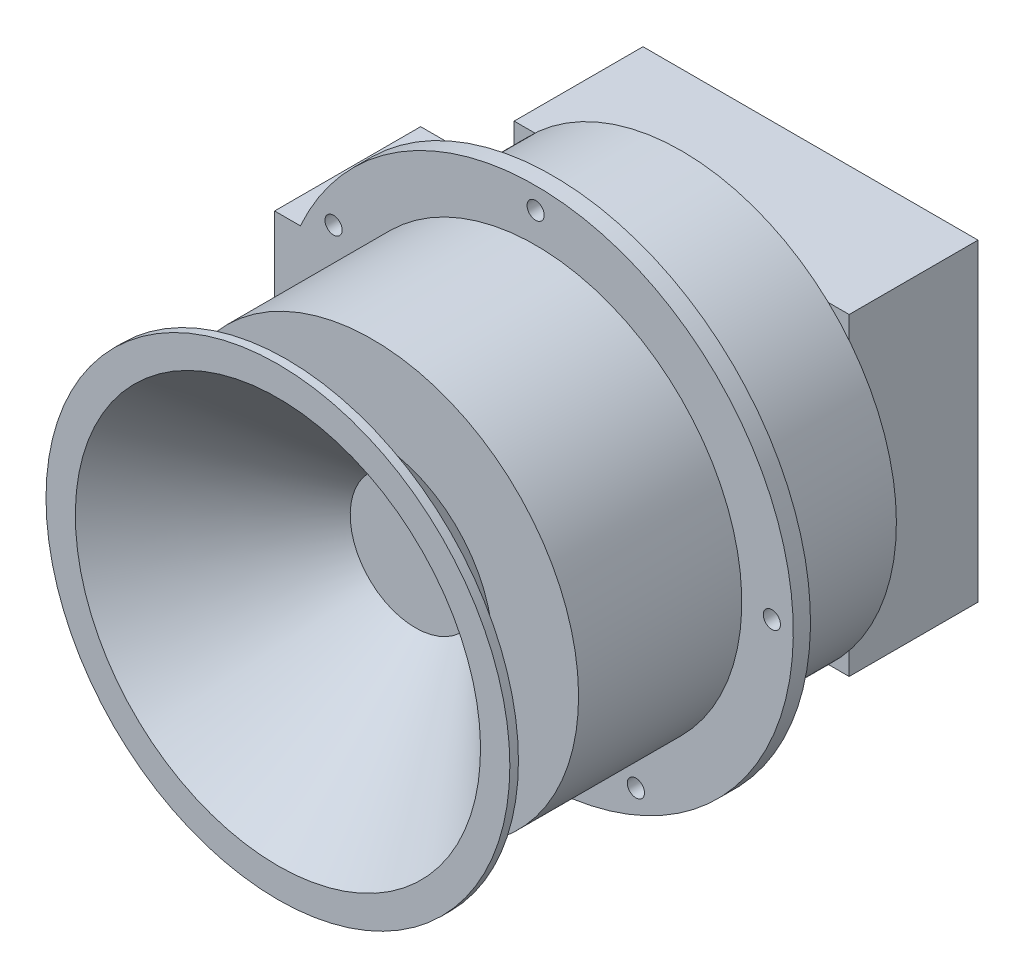
ISO-10303-21;
HEADER;
FILE_DESCRIPTION(('STEP AP214'),'2;1');
FILE_NAME('part.step','',(''),(''),'','','');
FILE_SCHEMA(('AUTOMOTIVE_DESIGN { 1 0 10303 214 1 1 1 1 }'));
ENDSEC;
DATA;
#1=APPLICATION_CONTEXT('core data for automotive mechanical design processes');
#2=APPLICATION_PROTOCOL_DEFINITION('international standard','automotive_design',2000,#1);
#3=PRODUCT_CONTEXT('',#1,'mechanical');
#4=PRODUCT('Part','Part','',(#3));
#5=PRODUCT_RELATED_PRODUCT_CATEGORY('part','',(#4));
#6=PRODUCT_DEFINITION_FORMATION('','',#4);
#7=PRODUCT_DEFINITION_CONTEXT('part definition',#1,'design');
#8=PRODUCT_DEFINITION('design','',#6,#7);
#9=PRODUCT_DEFINITION_SHAPE('','',#8);
#10=(LENGTH_UNIT() NAMED_UNIT(*) SI_UNIT(.MILLI.,.METRE.));
#11=(NAMED_UNIT(*) PLANE_ANGLE_UNIT() SI_UNIT($,.RADIAN.));
#12=(NAMED_UNIT(*) SI_UNIT($,.STERADIAN.) SOLID_ANGLE_UNIT());
#13=UNCERTAINTY_MEASURE_WITH_UNIT(LENGTH_MEASURE(1.E-05),#10,'distance_accuracy_value','');
#14=(GEOMETRIC_REPRESENTATION_CONTEXT(3) GLOBAL_UNCERTAINTY_ASSIGNED_CONTEXT((#13)) GLOBAL_UNIT_ASSIGNED_CONTEXT((#10,
#11,#12)) REPRESENTATION_CONTEXT('',''));
#15=CARTESIAN_POINT('',(0.,0.,0.));
#16=DIRECTION('',(0.,0.,1.));
#17=DIRECTION('',(1.,0.,0.));
#18=AXIS2_PLACEMENT_3D('',#15,#16,#17);
#19=CARTESIAN_POINT('',(-19.5,-18.25,-30.));
#20=DIRECTION('',(1.,0.,0.));
#21=DIRECTION('',(0.,0.,-1.));
#22=AXIS2_PLACEMENT_3D('',#19,#20,#21);
#23=PLANE('',#22);
#24=DIRECTION('',(0.,1.,0.));
#25=VECTOR('',#24,1.);
#26=CARTESIAN_POINT('',(-19.5,-18.25,-15.));
#27=LINE('',#26,#25);
#28=CARTESIAN_POINT('',(-19.5,-18.25,-15.));
#29=VERTEX_POINT('',#28);
#30=CARTESIAN_POINT('',(-19.5,18.25,-15.));
#31=VERTEX_POINT('',#30);
#32=EDGE_CURVE('E112',#29,#31,#27,.T.);
#33=ORIENTED_EDGE('',*,*,#32,.T.);
#34=DIRECTION('',(0.,0.,1.));
#35=VECTOR('',#34,1.);
#36=CARTESIAN_POINT('',(-19.5,18.25,-30.));
#37=LINE('',#36,#35);
#38=CARTESIAN_POINT('',(-19.5,18.25,-30.));
#39=VERTEX_POINT('',#38);
#40=EDGE_CURVE('E12',#39,#31,#37,.T.);
#41=ORIENTED_EDGE('',*,*,#40,.F.);
#42=DIRECTION('',(0.,1.,0.));
#43=VECTOR('',#42,1.);
#44=CARTESIAN_POINT('',(-19.5,-18.25,-30.));
#45=LINE('',#44,#43);
#46=CARTESIAN_POINT('',(-19.5,-18.25,-30.));
#47=VERTEX_POINT('',#46);
#48=EDGE_CURVE('E100',#47,#39,#45,.T.);
#49=ORIENTED_EDGE('',*,*,#48,.F.);
#50=DIRECTION('',(0.,0.,1.));
#51=VECTOR('',#50,1.);
#52=CARTESIAN_POINT('',(-19.5,-18.25,-30.));
#53=LINE('',#52,#51);
#54=EDGE_CURVE('E108',#47,#29,#53,.T.);
#55=ORIENTED_EDGE('',*,*,#54,.T.);
#56=EDGE_LOOP('',(#33,#41,#49,#55));
#57=FACE_BOUND('',#56,.T.);
#58=ADVANCED_FACE('F49',(#57),#23,.F.);
#59=CARTESIAN_POINT('',(19.5,18.25,-30.));
#60=DIRECTION('',(0.,-1.,0.));
#61=DIRECTION('',(0.,0.,-1.));
#62=AXIS2_PLACEMENT_3D('',#59,#60,#61);
#63=PLANE('',#62);
#64=DIRECTION('',(1.,0.,0.));
#65=VECTOR('',#64,1.);
#66=CARTESIAN_POINT('',(19.5,18.25,-15.));
#67=LINE('',#66,#65);
#68=CARTESIAN_POINT('',(19.5,18.25,-15.));
#69=VERTEX_POINT('',#68);
#70=EDGE_CURVE('E104',#31,#69,#67,.T.);
#71=ORIENTED_EDGE('',*,*,#70,.T.);
#72=DIRECTION('',(0.,0.,1.));
#73=VECTOR('',#72,1.);
#74=CARTESIAN_POINT('',(19.5,18.25,-30.));
#75=LINE('',#74,#73);
#76=CARTESIAN_POINT('',(19.5,18.25,-30.));
#77=VERTEX_POINT('',#76);
#78=EDGE_CURVE('E57',#77,#69,#75,.T.);
#79=ORIENTED_EDGE('',*,*,#78,.F.);
#80=DIRECTION('',(1.,0.,0.));
#81=VECTOR('',#80,1.);
#82=CARTESIAN_POINT('',(19.5,18.25,-30.));
#83=LINE('',#82,#81);
#84=EDGE_CURVE('E95',#39,#77,#83,.T.);
#85=ORIENTED_EDGE('',*,*,#84,.F.);
#86=ORIENTED_EDGE('',*,*,#40,.T.);
#87=EDGE_LOOP('',(#71,#79,#85,#86));
#88=FACE_BOUND('',#87,.T.);
#89=ADVANCED_FACE('F103',(#88),#63,.F.);
#90=CARTESIAN_POINT('',(19.5,-18.25,-30.));
#91=DIRECTION('',(-1.,0.,0.));
#92=DIRECTION('',(0.,0.,1.));
#93=AXIS2_PLACEMENT_3D('',#90,#91,#92);
#94=PLANE('',#93);
#95=DIRECTION('',(0.,-1.,0.));
#96=VECTOR('',#95,1.);
#97=CARTESIAN_POINT('',(19.5,-18.25,-15.));
#98=LINE('',#97,#96);
#99=CARTESIAN_POINT('',(19.5,-18.25,-15.));
#100=VERTEX_POINT('',#99);
#101=EDGE_CURVE('E82',#69,#100,#98,.T.);
#102=ORIENTED_EDGE('',*,*,#101,.T.);
#103=DIRECTION('',(0.,0.,1.));
#104=VECTOR('',#103,1.);
#105=CARTESIAN_POINT('',(19.5,-18.25,-30.));
#106=LINE('',#105,#104);
#107=CARTESIAN_POINT('',(19.5,-18.25,-30.));
#108=VERTEX_POINT('',#107);
#109=EDGE_CURVE('E105',#108,#100,#106,.T.);
#110=ORIENTED_EDGE('',*,*,#109,.F.);
#111=DIRECTION('',(0.,-1.,0.));
#112=VECTOR('',#111,1.);
#113=CARTESIAN_POINT('',(19.5,-18.25,-30.));
#114=LINE('',#113,#112);
#115=EDGE_CURVE('E98',#77,#108,#114,.T.);
#116=ORIENTED_EDGE('',*,*,#115,.F.);
#117=ORIENTED_EDGE('',*,*,#78,.T.);
#118=EDGE_LOOP('',(#102,#110,#116,#117));
#119=FACE_BOUND('',#118,.T.);
#120=ADVANCED_FACE('F106',(#119),#94,.F.);
#121=CARTESIAN_POINT('',(19.5,-18.25,-30.));
#122=DIRECTION('',(0.,1.,0.));
#123=DIRECTION('',(0.,0.,1.));
#124=AXIS2_PLACEMENT_3D('',#121,#122,#123);
#125=PLANE('',#124);
#126=DIRECTION('',(-1.,0.,0.));
#127=VECTOR('',#126,1.);
#128=CARTESIAN_POINT('',(19.5,-18.25,-15.));
#129=LINE('',#128,#127);
#130=EDGE_CURVE('E88',#100,#29,#129,.T.);
#131=ORIENTED_EDGE('',*,*,#130,.T.);
#132=ORIENTED_EDGE('',*,*,#54,.F.);
#133=DIRECTION('',(-1.,0.,0.));
#134=VECTOR('',#133,1.);
#135=CARTESIAN_POINT('',(19.5,-18.25,-30.));
#136=LINE('',#135,#134);
#137=EDGE_CURVE('E65',#108,#47,#136,.T.);
#138=ORIENTED_EDGE('',*,*,#137,.F.);
#139=ORIENTED_EDGE('',*,*,#109,.T.);
#140=EDGE_LOOP('',(#131,#132,#138,#139));
#141=FACE_BOUND('',#140,.T.);
#142=ADVANCED_FACE('F119',(#141),#125,.F.);
#143=CARTESIAN_POINT('',(0.,0.,-30.));
#144=DIRECTION('',(0.,0.,1.));
#145=DIRECTION('',(1.,0.,0.));
#146=AXIS2_PLACEMENT_3D('',#143,#144,#145);
#147=PLANE('',#146);
#148=ORIENTED_EDGE('',*,*,#48,.T.);
#149=ORIENTED_EDGE('',*,*,#84,.T.);
#150=ORIENTED_EDGE('',*,*,#115,.T.);
#151=ORIENTED_EDGE('',*,*,#137,.T.);
#152=EDGE_LOOP('',(#148,#149,#150,#151));
#153=FACE_BOUND('',#152,.T.);
#154=ADVANCED_FACE('F96',(#153),#147,.F.);
#155=CARTESIAN_POINT('',(0.,0.,-15.));
#156=DIRECTION('',(0.,0.,1.));
#157=DIRECTION('',(1.,0.,0.));
#158=AXIS2_PLACEMENT_3D('',#155,#156,#157);
#159=PLANE('',#158);
#160=ORIENTED_EDGE('',*,*,#32,.F.);
#161=ORIENTED_EDGE('',*,*,#130,.F.);
#162=ORIENTED_EDGE('',*,*,#101,.F.);
#163=ORIENTED_EDGE('',*,*,#70,.F.);
#164=EDGE_LOOP('',(#160,#161,#162,#163));
#165=FACE_BOUND('',#164,.T.);
#166=ADVANCED_FACE('F122',(#165),#159,.T.);
#167=CLOSED_SHELL('',(#58,#89,#120,#142,#154,#166));
#168=MANIFOLD_SOLID_BREP('B2',#167);
#169=CARTESIAN_POINT('',(0.,0.,15.));
#170=DIRECTION('',(0.,0.,-1.));
#171=DIRECTION('',(-1.,0.,0.));
#172=AXIS2_PLACEMENT_3D('',#169,#170,#171);
#173=CYLINDRICAL_SURFACE('',#172,24.);
#174=CARTESIAN_POINT('',(0.,0.,20.9999999999998));
#175=DIRECTION('',(0.,0.,1.));
#176=DIRECTION('',(0.,-1.,0.));
#177=AXIS2_PLACEMENT_3D('',#174,#175,#176);
#178=CIRCLE('',#177,24.);
#179=CARTESIAN_POINT('',(0.,-24.0000000000001,20.9999999999997));
#180=VERTEX_POINT('',#179);
#181=EDGE_CURVE('E270',#180,#180,#178,.T.);
#182=ORIENTED_EDGE('',*,*,#181,.F.);
#183=EDGE_LOOP('',(#182));
#184=FACE_BOUND('',#183,.T.);
#185=DIRECTION('',(0.,0.,-1.));
#186=VECTOR('',#185,1.);
#187=CARTESIAN_POINT('',(-23.4791666666667,4.97279927595,5.25));
#188=LINE('',#187,#186);
#189=CARTESIAN_POINT('',(-23.4791666666667,4.97279927595001,8.5));
#190=VERTEX_POINT('',#189);
#191=CARTESIAN_POINT('',(-23.4791666666667,4.97279927595001,2.));
#192=VERTEX_POINT('',#191);
#193=EDGE_CURVE('E47',#190,#192,#188,.T.);
#194=ORIENTED_EDGE('',*,*,#193,.F.);
#195=CARTESIAN_POINT('',(0.,0.,8.5));
#196=DIRECTION('',(0.,0.,1.));
#197=DIRECTION('',(1.,0.,0.));
#198=AXIS2_PLACEMENT_3D('',#195,#196,#197);
#199=CIRCLE('',#198,24.);
#200=CARTESIAN_POINT('',(-23.4791666666667,-4.97279927595001,8.5));
#201=VERTEX_POINT('',#200);
#202=EDGE_CURVE('E259',#190,#201,#199,.T.);
#203=ORIENTED_EDGE('',*,*,#202,.T.);
#204=DIRECTION('',(0.,0.,-1.));
#205=VECTOR('',#204,1.);
#206=CARTESIAN_POINT('',(-23.4791666666667,-4.97279927595,5.25));
#207=LINE('',#206,#205);
#208=CARTESIAN_POINT('',(-23.4791666666667,-4.97279927595001,2.));
#209=VERTEX_POINT('',#208);
#210=EDGE_CURVE('E182',#209,#201,#207,.F.);
#211=ORIENTED_EDGE('',*,*,#210,.F.);
#212=CARTESIAN_POINT('',(0.,0.,2.));
#213=DIRECTION('',(0.,0.,1.));
#214=DIRECTION('',(1.,0.,0.));
#215=AXIS2_PLACEMENT_3D('',#212,#213,#214);
#216=CIRCLE('',#215,24.);
#217=EDGE_CURVE('E255',#209,#192,#216,.T.);
#218=ORIENTED_EDGE('',*,*,#217,.T.);
#219=EDGE_LOOP('',(#194,#203,#211,#218));
#220=FACE_BOUND('',#219,.T.);
#221=ADVANCED_FACE('F173',(#184,#220),#173,.T.);
#222=CARTESIAN_POINT('',(0.,0.,0.));
#223=DIRECTION('',(0.,0.,1.));
#224=DIRECTION('',(1.,0.,0.));
#225=AXIS2_PLACEMENT_3D('',#222,#223,#224);
#226=PLANE('',#225);
#227=CARTESIAN_POINT('',(11.6772727272727,-24.8976163849653,0.));
#228=DIRECTION('',(0.,0.,1.));
#229=DIRECTION('',(1.,0.,0.));
#230=AXIS2_PLACEMENT_3D('',#227,#228,#229);
#231=CIRCLE('',#230,1.);
#232=CARTESIAN_POINT('',(12.6772727272727,-24.8976163849653,0.));
#233=VERTEX_POINT('',#232);
#234=EDGE_CURVE('E303',#233,#233,#231,.T.);
#235=ORIENTED_EDGE('',*,*,#234,.T.);
#236=EDGE_LOOP('',(#235));
#237=FACE_BOUND('',#236,.T.);
#238=CARTESIAN_POINT('',(27.5,0.,0.));
#239=DIRECTION('',(0.,0.,1.));
#240=DIRECTION('',(1.,0.,0.));
#241=AXIS2_PLACEMENT_3D('',#238,#239,#240);
#242=CIRCLE('',#241,1.);
#243=CARTESIAN_POINT('',(28.5,0.,0.));
#244=VERTEX_POINT('',#243);
#245=EDGE_CURVE('E308',#244,#244,#242,.T.);
#246=ORIENTED_EDGE('',*,*,#245,.T.);
#247=EDGE_LOOP('',(#246));
#248=FACE_BOUND('',#247,.T.);
#249=CARTESIAN_POINT('',(-23.5226916995778,14.2454545454545,0.));
#250=DIRECTION('',(0.,0.,1.));
#251=DIRECTION('',(1.,0.,0.));
#252=AXIS2_PLACEMENT_3D('',#249,#250,#251);
#253=CIRCLE('',#252,1.);
#254=CARTESIAN_POINT('',(-22.5226916995778,14.2454545454545,0.));
#255=VERTEX_POINT('',#254);
#256=EDGE_CURVE('E316',#255,#255,#253,.T.);
#257=ORIENTED_EDGE('',*,*,#256,.T.);
#258=EDGE_LOOP('',(#257));
#259=FACE_BOUND('',#258,.T.);
#260=CARTESIAN_POINT('',(0.,27.5,0.));
#261=DIRECTION('',(0.,0.,1.));
#262=DIRECTION('',(1.,0.,0.));
#263=AXIS2_PLACEMENT_3D('',#260,#261,#262);
#264=CIRCLE('',#263,1.);
#265=CARTESIAN_POINT('',(1.,27.5,0.));
#266=VERTEX_POINT('',#265);
#267=EDGE_CURVE('E324',#266,#266,#264,.T.);
#268=ORIENTED_EDGE('',*,*,#267,.T.);
#269=EDGE_LOOP('',(#268));
#270=FACE_BOUND('',#269,.T.);
#271=DIRECTION('',(-1.,0.,0.));
#272=VECTOR('',#271,1.);
#273=CARTESIAN_POINT('',(-25.2914363276566,-18.7545454545455,0.));
#274=LINE('',#273,#272);
#275=CARTESIAN_POINT('',(-16.5307902047479,-18.7545454545455,0.));
#276=VERTEX_POINT('',#275);
#277=CARTESIAN_POINT('',(-23.4151024937622,-18.7545454545455,0.));
#278=VERTEX_POINT('',#277);
#279=EDGE_CURVE('E196',#276,#278,#274,.T.);
#280=ORIENTED_EDGE('',*,*,#279,.F.);
#281=CARTESIAN_POINT('',(0.,0.,0.));
#282=DIRECTION('',(0.,0.,-1.));
#283=DIRECTION('',(-1.,0.,0.));
#284=AXIS2_PLACEMENT_3D('',#281,#282,#283);
#285=CIRCLE('',#284,25.);
#286=CARTESIAN_POINT('',(-21.7956152235996,12.2454545454545,0.));
#287=VERTEX_POINT('',#286);
#288=EDGE_CURVE('E291',#287,#276,#285,.T.);
#289=ORIENTED_EDGE('',*,*,#288,.F.);
#290=DIRECTION('',(1.,0.,0.));
#291=VECTOR('',#290,1.);
#292=CARTESIAN_POINT('',(-27.3870196073835,12.2454545454545,0.));
#293=LINE('',#292,#291);
#294=CARTESIAN_POINT('',(-27.3870196073835,12.2454545454545,0.));
#295=VERTEX_POINT('',#294);
#296=EDGE_CURVE('E260',#295,#287,#293,.T.);
#297=ORIENTED_EDGE('',*,*,#296,.F.);
#298=CARTESIAN_POINT('',(0.,0.,0.));
#299=DIRECTION('',(0.,0.,1.));
#300=DIRECTION('',(1.,0.,0.));
#301=AXIS2_PLACEMENT_3D('',#298,#299,#300);
#302=CIRCLE('',#301,30.);
#303=EDGE_CURVE('E332',#278,#295,#302,.T.);
#304=ORIENTED_EDGE('',*,*,#303,.F.);
#305=EDGE_LOOP('',(#280,#289,#297,#304));
#306=FACE_BOUND('',#305,.T.);
#307=ADVANCED_FACE('F379',(#237,#248,#259,#270,#306),#226,.F.);
#308=CARTESIAN_POINT('',(0.,0.,2.));
#309=DIRECTION('',(0.,0.,1.));
#310=DIRECTION('',(1.,0.,0.));
#311=AXIS2_PLACEMENT_3D('',#308,#309,#310);
#312=PLANE('',#311);
#313=ORIENTED_EDGE('',*,*,#217,.F.);
#314=CARTESIAN_POINT('',(-24.,0.,2.));
#315=DIRECTION('',(0.,0.,1.));
#316=DIRECTION('',(1.,0.,0.));
#317=AXIS2_PLACEMENT_3D('',#314,#315,#316);
#318=CIRCLE('',#317,5.);
#319=EDGE_CURVE('E246',#192,#209,#318,.T.);
#320=ORIENTED_EDGE('',*,*,#319,.F.);
#321=EDGE_LOOP('',(#313,#320));
#322=FACE_BOUND('',#321,.T.);
#323=CARTESIAN_POINT('',(27.5,0.,2.));
#324=DIRECTION('',(0.,0.,1.));
#325=DIRECTION('',(1.,0.,0.));
#326=AXIS2_PLACEMENT_3D('',#323,#324,#325);
#327=CIRCLE('',#326,1.);
#328=CARTESIAN_POINT('',(28.5,0.,2.));
#329=VERTEX_POINT('',#328);
#330=EDGE_CURVE('E312',#329,#329,#327,.T.);
#331=ORIENTED_EDGE('',*,*,#330,.F.);
#332=EDGE_LOOP('',(#331));
#333=FACE_BOUND('',#332,.T.);
#334=CARTESIAN_POINT('',(0.,27.5,2.));
#335=DIRECTION('',(0.,0.,1.));
#336=DIRECTION('',(1.,0.,0.));
#337=AXIS2_PLACEMENT_3D('',#334,#335,#336);
#338=CIRCLE('',#337,1.);
#339=CARTESIAN_POINT('',(1.,27.5,2.));
#340=VERTEX_POINT('',#339);
#341=EDGE_CURVE('E328',#340,#340,#338,.T.);
#342=ORIENTED_EDGE('',*,*,#341,.F.);
#343=EDGE_LOOP('',(#342));
#344=FACE_BOUND('',#343,.T.);
#345=CARTESIAN_POINT('',(0.,0.,2.));
#346=DIRECTION('',(0.,0.,1.));
#347=DIRECTION('',(1.,0.,0.));
#348=AXIS2_PLACEMENT_3D('',#345,#346,#347);
#349=CIRCLE('',#348,30.);
#350=CARTESIAN_POINT('',(-23.4151024937622,-18.7545454545455,2.));
#351=VERTEX_POINT('',#350);
#352=CARTESIAN_POINT('',(-27.3870196073835,12.2454545454545,2.));
#353=VERTEX_POINT('',#352);
#354=EDGE_CURVE('E336',#351,#353,#349,.T.);
#355=ORIENTED_EDGE('',*,*,#354,.T.);
#356=DIRECTION('',(-1.,0.,0.));
#357=VECTOR('',#356,1.);
#358=CARTESIAN_POINT('',(-27.3870196073835,12.2454545454545,2.));
#359=LINE('',#358,#357);
#360=CARTESIAN_POINT('',(-30.3870196073835,12.2454545454545,2.));
#361=VERTEX_POINT('',#360);
#362=EDGE_CURVE('E340',#353,#361,#359,.T.);
#363=ORIENTED_EDGE('',*,*,#362,.T.);
#364=DIRECTION('',(0.,-1.,0.));
#365=VECTOR('',#364,1.);
#366=CARTESIAN_POINT('',(-30.3870196073835,12.2454545454545,2.));
#367=LINE('',#366,#365);
#368=CARTESIAN_POINT('',(-30.3870196073835,-4.75454545454546,2.));
#369=VERTEX_POINT('',#368);
#370=EDGE_CURVE('E343',#361,#369,#367,.T.);
#371=ORIENTED_EDGE('',*,*,#370,.T.);
#372=DIRECTION('',(0.34202014332567,-0.939692620785908,0.));
#373=VECTOR('',#372,1.);
#374=CARTESIAN_POINT('',(-30.3870196073835,-4.75454545454546,2.));
#375=LINE('',#374,#373);
#376=CARTESIAN_POINT('',(-25.2914363276566,-18.7545454545455,2.));
#377=VERTEX_POINT('',#376);
#378=EDGE_CURVE('E346',#369,#377,#375,.T.);
#379=ORIENTED_EDGE('',*,*,#378,.T.);
#380=DIRECTION('',(1.,0.,0.));
#381=VECTOR('',#380,1.);
#382=CARTESIAN_POINT('',(-25.2914363276566,-18.7545454545455,2.));
#383=LINE('',#382,#381);
#384=EDGE_CURVE('E349',#377,#351,#383,.T.);
#385=ORIENTED_EDGE('',*,*,#384,.T.);
#386=EDGE_LOOP('',(#355,#363,#371,#379,#385));
#387=FACE_BOUND('',#386,.T.);
#388=CARTESIAN_POINT('',(-23.5226916995778,14.2454545454545,2.));
#389=DIRECTION('',(0.,0.,1.));
#390=DIRECTION('',(1.,0.,0.));
#391=AXIS2_PLACEMENT_3D('',#388,#389,#390);
#392=CIRCLE('',#391,1.);
#393=CARTESIAN_POINT('',(-22.5226916995778,14.2454545454545,2.));
#394=VERTEX_POINT('',#393);
#395=EDGE_CURVE('E320',#394,#394,#392,.T.);
#396=ORIENTED_EDGE('',*,*,#395,.F.);
#397=EDGE_LOOP('',(#396));
#398=FACE_BOUND('',#397,.T.);
#399=CARTESIAN_POINT('',(11.6772727272727,-24.8976163849653,2.));
#400=DIRECTION('',(0.,0.,1.));
#401=DIRECTION('',(1.,0.,0.));
#402=AXIS2_PLACEMENT_3D('',#399,#400,#401);
#403=CIRCLE('',#402,1.);
#404=CARTESIAN_POINT('',(12.6772727272727,-24.8976163849653,2.));
#405=VERTEX_POINT('',#404);
#406=EDGE_CURVE('E304',#405,#405,#403,.T.);
#407=ORIENTED_EDGE('',*,*,#406,.F.);
#408=EDGE_LOOP('',(#407));
#409=FACE_BOUND('',#408,.T.);
#410=ADVANCED_FACE('F253',(#322,#333,#344,#387,#398,#409),#312,.T.);
#411=CARTESIAN_POINT('',(0.,0.,2.));
#412=DIRECTION('',(0.,0.,-1.));
#413=DIRECTION('',(-1.,0.,0.));
#414=AXIS2_PLACEMENT_3D('',#411,#412,#413);
#415=CYLINDRICAL_SURFACE('',#414,30.);
#416=ORIENTED_EDGE('',*,*,#303,.T.);
#417=DIRECTION('',(0.,0.,-1.));
#418=VECTOR('',#417,1.);
#419=CARTESIAN_POINT('',(-27.3870196073835,12.2454545454545,2.));
#420=LINE('',#419,#418);
#421=EDGE_CURVE('E266',#353,#295,#420,.T.);
#422=ORIENTED_EDGE('',*,*,#421,.F.);
#423=ORIENTED_EDGE('',*,*,#354,.F.);
#424=DIRECTION('',(0.,0.,-1.));
#425=VECTOR('',#424,1.);
#426=CARTESIAN_POINT('',(-23.4151024937622,-18.7545454545455,2.));
#427=LINE('',#426,#425);
#428=EDGE_CURVE('E352',#351,#278,#427,.T.);
#429=ORIENTED_EDGE('',*,*,#428,.T.);
#430=EDGE_LOOP('',(#416,#422,#423,#429));
#431=FACE_BOUND('',#430,.T.);
#432=ADVANCED_FACE('F175',(#431),#415,.T.);
#433=CARTESIAN_POINT('',(-27.3870196073835,12.2454545454545,2.));
#434=DIRECTION('',(0.,-1.,0.));
#435=DIRECTION('',(0.,0.,-1.));
#436=AXIS2_PLACEMENT_3D('',#433,#434,#435);
#437=PLANE('',#436);
#438=ORIENTED_EDGE('',*,*,#421,.T.);
#439=ORIENTED_EDGE('',*,*,#296,.T.);
#440=DIRECTION('',(0.,0.,1.));
#441=VECTOR('',#440,1.);
#442=CARTESIAN_POINT('',(-21.7956152235996,12.2454545454545,-15.));
#443=LINE('',#442,#441);
#444=CARTESIAN_POINT('',(-21.7956152235996,12.2454545454545,-15.));
#445=VERTEX_POINT('',#444);
#446=EDGE_CURVE('E299',#445,#287,#443,.T.);
#447=ORIENTED_EDGE('',*,*,#446,.F.);
#448=DIRECTION('',(1.,0.,0.));
#449=VECTOR('',#448,1.);
#450=CARTESIAN_POINT('',(-27.3870196073835,12.2454545454545,-15.));
#451=LINE('',#450,#449);
#452=CARTESIAN_POINT('',(-30.3870196073835,12.2454545454545,-15.));
#453=VERTEX_POINT('',#452);
#454=EDGE_CURVE('E280',#453,#445,#451,.T.);
#455=ORIENTED_EDGE('',*,*,#454,.F.);
#456=DIRECTION('',(0.,0.,-1.));
#457=VECTOR('',#456,1.);
#458=CARTESIAN_POINT('',(-30.3870196073835,12.2454545454545,2.));
#459=LINE('',#458,#457);
#460=EDGE_CURVE('E364',#361,#453,#459,.T.);
#461=ORIENTED_EDGE('',*,*,#460,.F.);
#462=ORIENTED_EDGE('',*,*,#362,.F.);
#463=EDGE_LOOP('',(#438,#439,#447,#455,#461,#462));
#464=FACE_BOUND('',#463,.T.);
#465=ADVANCED_FACE('F428',(#464),#437,.F.);
#466=CARTESIAN_POINT('',(-30.3870196073835,12.2454545454545,2.));
#467=DIRECTION('',(1.,0.,0.));
#468=DIRECTION('',(0.,0.,-1.));
#469=AXIS2_PLACEMENT_3D('',#466,#467,#468);
#470=PLANE('',#469);
#471=ORIENTED_EDGE('',*,*,#460,.T.);
#472=DIRECTION('',(0.,1.,0.));
#473=VECTOR('',#472,1.);
#474=CARTESIAN_POINT('',(-30.3870196073835,12.2454545454545,-15.));
#475=LINE('',#474,#473);
#476=CARTESIAN_POINT('',(-30.3870196073835,-4.75454545454546,-15.));
#477=VERTEX_POINT('',#476);
#478=EDGE_CURVE('E276',#477,#453,#475,.T.);
#479=ORIENTED_EDGE('',*,*,#478,.F.);
#480=DIRECTION('',(0.,0.,-1.));
#481=VECTOR('',#480,1.);
#482=CARTESIAN_POINT('',(-30.3870196073835,-4.75454545454546,2.));
#483=LINE('',#482,#481);
#484=EDGE_CURVE('E361',#369,#477,#483,.T.);
#485=ORIENTED_EDGE('',*,*,#484,.F.);
#486=ORIENTED_EDGE('',*,*,#370,.F.);
#487=EDGE_LOOP('',(#471,#479,#485,#486));
#488=FACE_BOUND('',#487,.T.);
#489=ADVANCED_FACE('F425',(#488),#470,.F.);
#490=CARTESIAN_POINT('',(-30.3870196073835,-4.75454545454546,2.));
#491=DIRECTION('',(0.939692620785908,0.34202014332567,0.));
#492=DIRECTION('',(-0.34202014332567,0.939692620785908,0.));
#493=AXIS2_PLACEMENT_3D('',#490,#491,#492);
#494=PLANE('',#493);
#495=ORIENTED_EDGE('',*,*,#484,.T.);
#496=DIRECTION('',(-0.34202014332567,0.939692620785908,0.));
#497=VECTOR('',#496,1.);
#498=CARTESIAN_POINT('',(-30.3870196073835,-4.75454545454546,-15.));
#499=LINE('',#498,#497);
#500=CARTESIAN_POINT('',(-25.2914363276566,-18.7545454545455,-15.));
#501=VERTEX_POINT('',#500);
#502=EDGE_CURVE('E272',#501,#477,#499,.T.);
#503=ORIENTED_EDGE('',*,*,#502,.F.);
#504=DIRECTION('',(0.,0.,-1.));
#505=VECTOR('',#504,1.);
#506=CARTESIAN_POINT('',(-25.2914363276566,-18.7545454545455,2.));
#507=LINE('',#506,#505);
#508=EDGE_CURVE('E358',#377,#501,#507,.T.);
#509=ORIENTED_EDGE('',*,*,#508,.F.);
#510=ORIENTED_EDGE('',*,*,#378,.F.);
#511=EDGE_LOOP('',(#495,#503,#509,#510));
#512=FACE_BOUND('',#511,.T.);
#513=ADVANCED_FACE('F421',(#512),#494,.F.);
#514=CARTESIAN_POINT('',(-25.2914363276566,-18.7545454545455,2.));
#515=DIRECTION('',(0.,1.,0.));
#516=DIRECTION('',(-1.,0.,0.));
#517=AXIS2_PLACEMENT_3D('',#514,#515,#516);
#518=PLANE('',#517);
#519=ORIENTED_EDGE('',*,*,#508,.T.);
#520=DIRECTION('',(-1.,0.,0.));
#521=VECTOR('',#520,1.);
#522=CARTESIAN_POINT('',(-23.4151024937622,-18.7545454545455,-15.));
#523=LINE('',#522,#521);
#524=CARTESIAN_POINT('',(-16.5307902047479,-18.7545454545455,-15.));
#525=VERTEX_POINT('',#524);
#526=EDGE_CURVE('E286',#525,#501,#523,.T.);
#527=ORIENTED_EDGE('',*,*,#526,.F.);
#528=DIRECTION('',(0.,0.,1.));
#529=VECTOR('',#528,1.);
#530=CARTESIAN_POINT('',(-16.5307902047479,-18.7545454545455,-15.));
#531=LINE('',#530,#529);
#532=EDGE_CURVE('E289',#525,#276,#531,.T.);
#533=ORIENTED_EDGE('',*,*,#532,.T.);
#534=ORIENTED_EDGE('',*,*,#279,.T.);
#535=ORIENTED_EDGE('',*,*,#428,.F.);
#536=ORIENTED_EDGE('',*,*,#384,.F.);
#537=EDGE_LOOP('',(#519,#527,#533,#534,#535,#536));
#538=FACE_BOUND('',#537,.T.);
#539=ADVANCED_FACE('F415',(#538),#518,.F.);
#540=CARTESIAN_POINT('',(0.,27.5,2.));
#541=DIRECTION('',(0.,0.,-1.));
#542=DIRECTION('',(-1.,0.,0.));
#543=AXIS2_PLACEMENT_3D('',#540,#541,#542);
#544=CYLINDRICAL_SURFACE('',#543,1.);
#545=ORIENTED_EDGE('',*,*,#341,.T.);
#546=EDGE_LOOP('',(#545));
#547=FACE_BOUND('',#546,.T.);
#548=ORIENTED_EDGE('',*,*,#267,.F.);
#549=EDGE_LOOP('',(#548));
#550=FACE_BOUND('',#549,.T.);
#551=ADVANCED_FACE('F411',(#547,#550),#544,.F.);
#552=CARTESIAN_POINT('',(-23.5226916995778,14.2454545454545,2.));
#553=DIRECTION('',(0.,0.,-1.));
#554=DIRECTION('',(-1.,0.,0.));
#555=AXIS2_PLACEMENT_3D('',#552,#553,#554);
#556=CYLINDRICAL_SURFACE('',#555,1.);
#557=ORIENTED_EDGE('',*,*,#395,.T.);
#558=EDGE_LOOP('',(#557));
#559=FACE_BOUND('',#558,.T.);
#560=ORIENTED_EDGE('',*,*,#256,.F.);
#561=EDGE_LOOP('',(#560));
#562=FACE_BOUND('',#561,.T.);
#563=ADVANCED_FACE('F407',(#559,#562),#556,.F.);
#564=CARTESIAN_POINT('',(27.5,0.,2.));
#565=DIRECTION('',(0.,0.,-1.));
#566=DIRECTION('',(-1.,0.,0.));
#567=AXIS2_PLACEMENT_3D('',#564,#565,#566);
#568=CYLINDRICAL_SURFACE('',#567,1.);
#569=ORIENTED_EDGE('',*,*,#330,.T.);
#570=EDGE_LOOP('',(#569));
#571=FACE_BOUND('',#570,.T.);
#572=ORIENTED_EDGE('',*,*,#245,.F.);
#573=EDGE_LOOP('',(#572));
#574=FACE_BOUND('',#573,.T.);
#575=ADVANCED_FACE('F403',(#571,#574),#568,.F.);
#576=CARTESIAN_POINT('',(11.6772727272727,-24.8976163849653,2.));
#577=DIRECTION('',(0.,0.,-1.));
#578=DIRECTION('',(-1.,0.,0.));
#579=AXIS2_PLACEMENT_3D('',#576,#577,#578);
#580=CYLINDRICAL_SURFACE('',#579,1.);
#581=ORIENTED_EDGE('',*,*,#406,.T.);
#582=EDGE_LOOP('',(#581));
#583=FACE_BOUND('',#582,.T.);
#584=ORIENTED_EDGE('',*,*,#234,.F.);
#585=EDGE_LOOP('',(#584));
#586=FACE_BOUND('',#585,.T.);
#587=ADVANCED_FACE('F399',(#583,#586),#580,.F.);
#588=CARTESIAN_POINT('',(0.,0.,-15.));
#589=DIRECTION('',(0.,0.,1.));
#590=DIRECTION('',(1.,0.,0.));
#591=AXIS2_PLACEMENT_3D('',#588,#589,#590);
#592=CYLINDRICAL_SURFACE('',#591,25.);
#593=ORIENTED_EDGE('',*,*,#288,.T.);
#594=ORIENTED_EDGE('',*,*,#532,.F.);
#595=CARTESIAN_POINT('',(0.,0.,-15.));
#596=DIRECTION('',(0.,0.,-1.));
#597=DIRECTION('',(-1.,0.,0.));
#598=AXIS2_PLACEMENT_3D('',#595,#596,#597);
#599=CIRCLE('',#598,25.);
#600=EDGE_CURVE('E283',#445,#525,#599,.T.);
#601=ORIENTED_EDGE('',*,*,#600,.F.);
#602=ORIENTED_EDGE('',*,*,#446,.T.);
#603=EDGE_LOOP('',(#593,#594,#601,#602));
#604=FACE_BOUND('',#603,.T.);
#605=ADVANCED_FACE('F395',(#604),#592,.T.);
#606=CARTESIAN_POINT('',(0.,0.,-15.));
#607=DIRECTION('',(0.,0.,-1.));
#608=DIRECTION('',(-1.,0.,0.));
#609=AXIS2_PLACEMENT_3D('',#606,#607,#608);
#610=PLANE('',#609);
#611=ORIENTED_EDGE('',*,*,#502,.T.);
#612=ORIENTED_EDGE('',*,*,#478,.T.);
#613=ORIENTED_EDGE('',*,*,#454,.T.);
#614=ORIENTED_EDGE('',*,*,#600,.T.);
#615=ORIENTED_EDGE('',*,*,#526,.T.);
#616=EDGE_LOOP('',(#611,#612,#613,#614,#615));
#617=FACE_BOUND('',#616,.T.);
#618=ADVANCED_FACE('F392',(#617),#610,.T.);
#619=CARTESIAN_POINT('',(0.,24.,21.));
#620=DIRECTION('',(0.,0.,-1.));
#621=DIRECTION('',(0.,1.,0.));
#622=AXIS2_PLACEMENT_3D('',#619,#620,#621);
#623=PLANE('',#622);
#624=CARTESIAN_POINT('',(0.,0.,20.9999999999999));
#625=DIRECTION('',(0.,0.,1.));
#626=DIRECTION('',(0.,-1.,0.));
#627=AXIS2_PLACEMENT_3D('',#624,#625,#626);
#628=CIRCLE('',#627,14.);
#629=CARTESIAN_POINT('',(0.,-14.0000000000001,20.9999999999998));
#630=VERTEX_POINT('',#629);
#631=EDGE_CURVE('E666',#630,#630,#628,.T.);
#632=ORIENTED_EDGE('',*,*,#631,.F.);
#633=EDGE_LOOP('',(#632));
#634=FACE_BOUND('',#633,.T.);
#635=ORIENTED_EDGE('',*,*,#181,.T.);
#636=EDGE_LOOP('',(#635));
#637=FACE_BOUND('',#636,.T.);
#638=ADVANCED_FACE('F390',(#634,#637),#623,.F.);
#639=CARTESIAN_POINT('',(0.,0.,20.9999999999999));
#640=DIRECTION('',(0.,0.,1.));
#641=DIRECTION('',(0.,-1.,0.));
#642=AXIS2_PLACEMENT_3D('',#639,#640,#641);
#643=CONICAL_SURFACE('',#642,14.,0.785398163397455);
#644=CARTESIAN_POINT('',(0.,-1.04083408558607E-13,30.9999999999998));
#645=DIRECTION('',(0.,0.,1.));
#646=DIRECTION('',(0.,-1.,0.));
#647=AXIS2_PLACEMENT_3D('',#644,#645,#646);
#648=CIRCLE('',#647,24.0000000000001);
#649=CARTESIAN_POINT('',(0.,-24.0000000000002,30.9999999999997));
#650=VERTEX_POINT('',#649);
#651=EDGE_CURVE('E663',#650,#650,#648,.T.);
#652=ORIENTED_EDGE('',*,*,#651,.F.);
#653=EDGE_LOOP('',(#652));
#654=FACE_BOUND('',#653,.T.);
#655=ORIENTED_EDGE('',*,*,#631,.T.);
#656=EDGE_LOOP('',(#655));
#657=FACE_BOUND('',#656,.T.);
#658=ADVANCED_FACE('F565',(#654,#657),#643,.T.);
#659=CARTESIAN_POINT('',(0.,24.,31.));
#660=DIRECTION('',(0.,0.,1.));
#661=DIRECTION('',(0.,-1.,0.));
#662=AXIS2_PLACEMENT_3D('',#659,#660,#661);
#663=PLANE('',#662);
#664=CARTESIAN_POINT('',(0.,-1.04083408558607E-13,30.9999999999998));
#665=DIRECTION('',(0.,0.,1.));
#666=DIRECTION('',(0.,-1.,0.));
#667=AXIS2_PLACEMENT_3D('',#664,#665,#666);
#668=CIRCLE('',#667,27.0000000000001);
#669=CARTESIAN_POINT('',(0.,-27.0000000000002,30.9999999999996));
#670=VERTEX_POINT('',#669);
#671=EDGE_CURVE('E659',#670,#670,#668,.T.);
#672=ORIENTED_EDGE('',*,*,#671,.F.);
#673=EDGE_LOOP('',(#672));
#674=FACE_BOUND('',#673,.T.);
#675=ORIENTED_EDGE('',*,*,#651,.T.);
#676=EDGE_LOOP('',(#675));
#677=FACE_BOUND('',#676,.T.);
#678=ADVANCED_FACE('F573',(#674,#677),#663,.F.);
#679=CARTESIAN_POINT('',(0.,0.,16.));
#680=DIRECTION('',(0.,0.,1.));
#681=DIRECTION('',(0.,-1.,0.));
#682=AXIS2_PLACEMENT_3D('',#679,#680,#681);
#683=CYLINDRICAL_SURFACE('',#682,27.0000000000001);
#684=CARTESIAN_POINT('',(0.,-1.11022302462514E-13,31.9999999999998));
#685=DIRECTION('',(0.,0.,1.));
#686=DIRECTION('',(0.,-1.,0.));
#687=AXIS2_PLACEMENT_3D('',#684,#685,#686);
#688=CIRCLE('',#687,27.0000000000001);
#689=CARTESIAN_POINT('',(0.,-27.0000000000002,31.9999999999996));
#690=VERTEX_POINT('',#689);
#691=EDGE_CURVE('E652',#690,#690,#688,.T.);
#692=ORIENTED_EDGE('',*,*,#691,.F.);
#693=EDGE_LOOP('',(#692));
#694=FACE_BOUND('',#693,.T.);
#695=ORIENTED_EDGE('',*,*,#671,.T.);
#696=EDGE_LOOP('',(#695));
#697=FACE_BOUND('',#696,.T.);
#698=ADVANCED_FACE('F581',(#694,#697),#683,.T.);
#699=CARTESIAN_POINT('',(0.,27.,32.));
#700=DIRECTION('',(0.,0.,-1.));
#701=DIRECTION('',(0.,1.,0.));
#702=AXIS2_PLACEMENT_3D('',#699,#700,#701);
#703=PLANE('',#702);
#704=CARTESIAN_POINT('',(0.,-1.11022302462514E-13,31.9999999999998));
#705=DIRECTION('',(0.,0.,1.));
#706=DIRECTION('',(0.,-1.,0.));
#707=AXIS2_PLACEMENT_3D('',#704,#705,#706);
#708=CIRCLE('',#707,23.585786437627);
#709=CARTESIAN_POINT('',(0.,-23.5857864376271,31.9999999999997));
#710=VERTEX_POINT('',#709);
#711=EDGE_CURVE('E647',#710,#710,#708,.T.);
#712=ORIENTED_EDGE('',*,*,#711,.F.);
#713=EDGE_LOOP('',(#712));
#714=FACE_BOUND('',#713,.T.);
#715=ORIENTED_EDGE('',*,*,#691,.T.);
#716=EDGE_LOOP('',(#715));
#717=FACE_BOUND('',#716,.T.);
#718=ADVANCED_FACE('F590',(#714,#717),#703,.F.);
#719=CARTESIAN_POINT('',(0.,-1.11022302462514E-13,31.9999999999998));
#720=DIRECTION('',(0.,0.,1.));
#721=DIRECTION('',(0.,-1.,0.));
#722=AXIS2_PLACEMENT_3D('',#719,#720,#721);
#723=CONICAL_SURFACE('',#722,23.585786437627,0.785398163397455);
#724=CARTESIAN_POINT('',(0.,0.,15.9999999999999));
#725=DIRECTION('',(0.,0.,1.));
#726=DIRECTION('',(0.,-1.,0.));
#727=AXIS2_PLACEMENT_3D('',#724,#725,#726);
#728=CIRCLE('',#727,7.58578643762692);
#729=CARTESIAN_POINT('',(0.,-7.58578643762693,15.9999999999999));
#730=VERTEX_POINT('',#729);
#731=EDGE_CURVE('E645',#730,#730,#728,.T.);
#732=CARTESIAN_POINT('',(0.,-7.58578643762693,15.9999999999999));
#733=CARTESIAN_POINT('',(0.,-7.7524531042936,16.1666666666666));
#734=CARTESIAN_POINT('',(0.,-7.91911977096026,16.3333333333332));
#735=CARTESIAN_POINT('',(0.,-8.2524531042936,16.6666666666666));
#736=CARTESIAN_POINT('',(0.,-8.41911977096027,16.8333333333332));
#737=CARTESIAN_POINT('',(0.,-8.75245310429361,17.1666666666666));
#738=CARTESIAN_POINT('',(0.,-8.91911977096028,17.3333333333332));
#739=CARTESIAN_POINT('',(0.,-9.25245310429362,17.6666666666665));
#740=CARTESIAN_POINT('',(0.,-9.41911977096028,17.8333333333332));
#741=CARTESIAN_POINT('',(0.,-9.75245310429362,18.1666666666665));
#742=CARTESIAN_POINT('',(0.,-9.91911977096029,18.3333333333332));
#743=CARTESIAN_POINT('',(0.,-10.2524531042936,18.6666666666665));
#744=CARTESIAN_POINT('',(0.,-10.4191197709603,18.8333333333332));
#745=CARTESIAN_POINT('',(0.,-10.7524531042936,19.1666666666665));
#746=CARTESIAN_POINT('',(0.,-10.9191197709603,19.3333333333332));
#747=CARTESIAN_POINT('',(0.,-11.2524531042936,19.6666666666665));
#748=CARTESIAN_POINT('',(0.,-11.4191197709603,19.8333333333332));
#749=CARTESIAN_POINT('',(0.,-11.7524531042937,20.1666666666665));
#750=CARTESIAN_POINT('',(0.,-11.9191197709603,20.3333333333332));
#751=CARTESIAN_POINT('',(0.,-12.2524531042937,20.6666666666665));
#752=CARTESIAN_POINT('',(0.,-12.4191197709603,20.8333333333332));
#753=CARTESIAN_POINT('',(0.,-12.7524531042937,21.1666666666665));
#754=CARTESIAN_POINT('',(0.,-12.9191197709603,21.3333333333332));
#755=CARTESIAN_POINT('',(0.,-13.2524531042937,21.6666666666665));
#756=CARTESIAN_POINT('',(0.,-13.4191197709603,21.8333333333332));
#757=CARTESIAN_POINT('',(0.,-13.7524531042937,22.1666666666665));
#758=CARTESIAN_POINT('',(0.,-13.9191197709603,22.3333333333331));
#759=CARTESIAN_POINT('',(0.,-14.2524531042937,22.6666666666665));
#760=CARTESIAN_POINT('',(0.,-14.4191197709604,22.8333333333331));
#761=CARTESIAN_POINT('',(0.,-14.7524531042937,23.1666666666665));
#762=CARTESIAN_POINT('',(0.,-14.9191197709604,23.3333333333331));
#763=CARTESIAN_POINT('',(0.,-15.2524531042937,23.6666666666665));
#764=CARTESIAN_POINT('',(0.,-15.4191197709604,23.8333333333331));
#765=CARTESIAN_POINT('',(0.,-15.7524531042937,24.1666666666665));
#766=CARTESIAN_POINT('',(0.,-15.9191197709604,24.3333333333331));
#767=CARTESIAN_POINT('',(0.,-16.2524531042937,24.6666666666664));
#768=CARTESIAN_POINT('',(0.,-16.4191197709604,24.8333333333331));
#769=CARTESIAN_POINT('',(0.,-16.7524531042937,25.1666666666664));
#770=CARTESIAN_POINT('',(0.,-16.9191197709604,25.3333333333331));
#771=CARTESIAN_POINT('',(0.,-17.2524531042937,25.6666666666664));
#772=CARTESIAN_POINT('',(0.,-17.4191197709604,25.8333333333331));
#773=CARTESIAN_POINT('',(0.,-17.7524531042937,26.1666666666664));
#774=CARTESIAN_POINT('',(0.,-17.9191197709604,26.3333333333331));
#775=CARTESIAN_POINT('',(0.,-18.2524531042937,26.6666666666664));
#776=CARTESIAN_POINT('',(0.,-18.4191197709604,26.8333333333331));
#777=CARTESIAN_POINT('',(0.,-18.7524531042937,27.1666666666664));
#778=CARTESIAN_POINT('',(0.,-18.9191197709604,27.3333333333331));
#779=CARTESIAN_POINT('',(0.,-19.2524531042937,27.6666666666664));
#780=CARTESIAN_POINT('',(0.,-19.4191197709604,27.8333333333331));
#781=CARTESIAN_POINT('',(0.,-19.7524531042938,28.1666666666664));
#782=CARTESIAN_POINT('',(0.,-19.9191197709604,28.3333333333331));
#783=CARTESIAN_POINT('',(0.,-20.2524531042938,28.6666666666664));
#784=CARTESIAN_POINT('',(0.,-20.4191197709604,28.8333333333331));
#785=CARTESIAN_POINT('',(0.,-20.7524531042938,29.1666666666664));
#786=CARTESIAN_POINT('',(0.,-20.9191197709604,29.333333333333));
#787=CARTESIAN_POINT('',(0.,-21.2524531042938,29.6666666666664));
#788=CARTESIAN_POINT('',(0.,-21.4191197709604,29.833333333333));
#789=CARTESIAN_POINT('',(0.,-21.7524531042938,30.1666666666664));
#790=CARTESIAN_POINT('',(0.,-21.9191197709604,30.333333333333));
#791=CARTESIAN_POINT('',(0.,-22.2524531042938,30.6666666666664));
#792=CARTESIAN_POINT('',(0.,-22.4191197709605,30.833333333333));
#793=CARTESIAN_POINT('',(0.,-22.7524531042938,31.1666666666664));
#794=CARTESIAN_POINT('',(0.,-22.9191197709605,31.333333333333));
#795=CARTESIAN_POINT('',(0.,-23.2524531042938,31.6666666666663));
#796=CARTESIAN_POINT('',(0.,-23.4191197709605,31.833333333333));
#797=CARTESIAN_POINT('',(0.,-23.5857864376271,31.9999999999997));
#798=B_SPLINE_CURVE_WITH_KNOTS('',3,(#732,#733,#734,#735,#736,#737,#738,#739,#740,#741,#742,
#743,#744,#745,#746,#747,#748,#749,#750,#751,#752,#753,#754,#755,#756,#757,#758,#759,#760,#761,
#762,#763,#764,#765,#766,#767,#768,#769,#770,#771,#772,#773,#774,#775,#776,#777,#778,#779,#780,
#781,#782,#783,#784,#785,#786,#787,#788,#789,#790,#791,#792,#793,#794,#795,#796,#797),
.UNSPECIFIED.,.F.,.F.,(4,2,2,2,2,2,2,2,2,2,2,2,2,2,2,2,2,2,2,2,2,2,2,2,2,2,2,2,2,2,2,2,4),(0.,
0.707106781186549,1.41421356237309,2.12132034355964,2.82842712474619,3.53553390593274,
4.24264068711928,4.94974746830583,5.65685424949238,6.36396103067893,7.07106781186547,
7.77817459305202,8.48528137423856,9.19238815542511,9.89949493661166,10.6066017177982,
11.3137084989848,12.0208152801713,12.7279220613578,13.4350288425444,14.1421356237309,
14.8492424049175,15.556349186104,16.2634559672906,16.9705627484771,17.6776695296637,
18.3847763108502,19.0918830920368,19.7989898732233,20.5060966544099,21.2132034355964,
21.920310216783,22.6274169979695),.UNSPECIFIED.);
#799=EDGE_CURVE('BSEAM599',#730,#710,#798,.T.);
#800=ORIENTED_EDGE('',*,*,#731,.F.);
#801=ORIENTED_EDGE('',*,*,#711,.T.);
#802=ORIENTED_EDGE('',*,*,#799,.T.);
#803=ORIENTED_EDGE('',*,*,#799,.F.);
#804=EDGE_LOOP('',(#800,#802,#801,#803));
#805=FACE_BOUND('',#804,.T.);
#806=ADVANCED_FACE('F599',(#805),#723,.F.);
#807=CARTESIAN_POINT('',(0.,7.58578643762692,16.));
#808=DIRECTION('',(0.,0.,-1.));
#809=DIRECTION('',(0.,1.,0.));
#810=AXIS2_PLACEMENT_3D('',#807,#808,#809);
#811=PLANE('',#810);
#812=ORIENTED_EDGE('',*,*,#731,.T.);
#813=EDGE_LOOP('',(#812));
#814=FACE_BOUND('',#813,.T.);
#815=ADVANCED_FACE('F376',(#814),#811,.F.);
#816=CARTESIAN_POINT('',(-24.,0.,8.5));
#817=DIRECTION('',(0.,0.,-1.));
#818=DIRECTION('',(-1.,0.,0.));
#819=AXIS2_PLACEMENT_3D('',#816,#817,#818);
#820=CYLINDRICAL_SURFACE('',#819,5.);
#821=CARTESIAN_POINT('',(-24.,0.,8.5));
#822=DIRECTION('',(0.,0.,1.));
#823=DIRECTION('',(1.,0.,0.));
#824=AXIS2_PLACEMENT_3D('',#821,#822,#823);
#825=CIRCLE('',#824,5.);
#826=EDGE_CURVE('E188',#190,#201,#825,.T.);
#827=ORIENTED_EDGE('',*,*,#826,.F.);
#828=ORIENTED_EDGE('',*,*,#193,.T.);
#829=ORIENTED_EDGE('',*,*,#319,.T.);
#830=ORIENTED_EDGE('',*,*,#210,.T.);
#831=EDGE_LOOP('',(#827,#828,#829,#830));
#832=FACE_BOUND('',#831,.T.);
#833=ADVANCED_FACE('F245',(#832),#820,.T.);
#834=CARTESIAN_POINT('',(-24.,0.,8.5));
#835=DIRECTION('',(0.,0.,1.));
#836=DIRECTION('',(1.,0.,0.));
#837=AXIS2_PLACEMENT_3D('',#834,#835,#836);
#838=PLANE('',#837);
#839=ORIENTED_EDGE('',*,*,#202,.F.);
#840=ORIENTED_EDGE('',*,*,#826,.T.);
#841=EDGE_LOOP('',(#839,#840));
#842=FACE_BOUND('',#841,.T.);
#843=ADVANCED_FACE('F370',(#842),#838,.T.);
#844=CLOSED_SHELL('',(#221,#307,#410,#432,#465,#489,#513,#539,#551,#563,#575,#587,#605,#618,
#638,#658,#678,#698,#718,#806,#815,#833,#843));
#845=MANIFOLD_SOLID_BREP('B6',#844);
#846=ADVANCED_BREP_SHAPE_REPRESENTATION('',(#18,#168,#845),#14);
#847=SHAPE_DEFINITION_REPRESENTATION(#9,#846);
ENDSEC;
END-ISO-10303-21;
